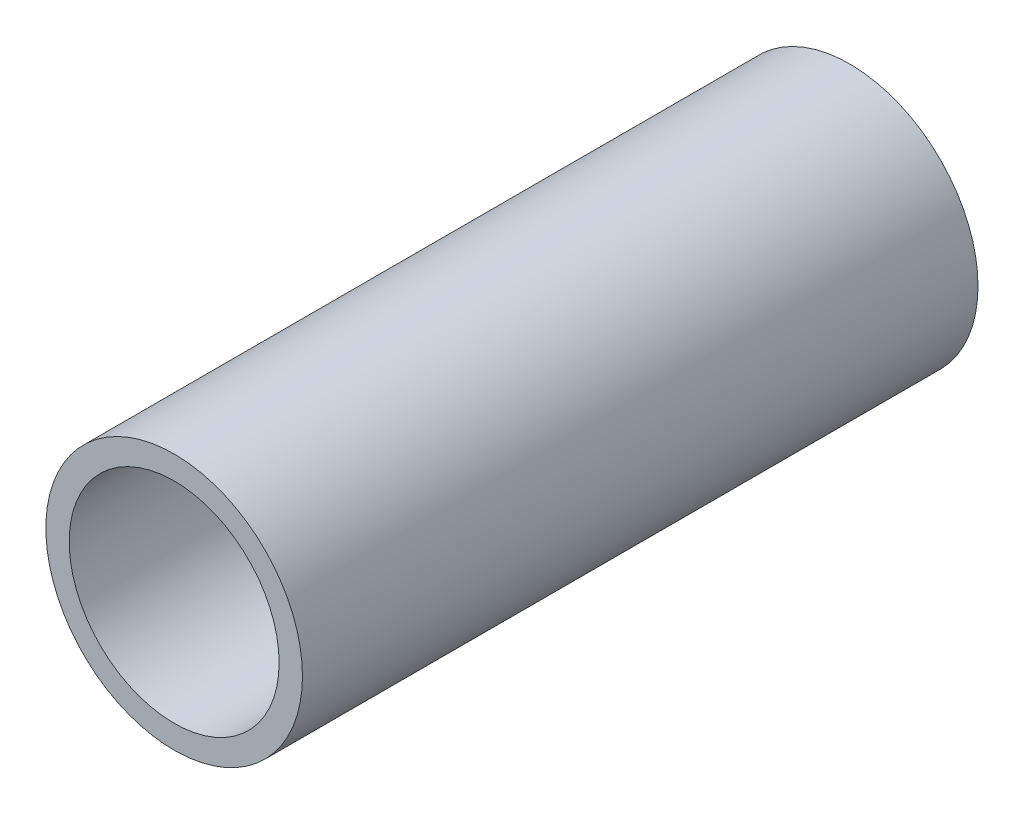
ISO-10303-21;
HEADER;
FILE_DESCRIPTION(('STEP AP214'),'2;1');
FILE_NAME('part.step','',(''),(''),'','','');
FILE_SCHEMA(('AUTOMOTIVE_DESIGN { 1 0 10303 214 1 1 1 1 }'));
ENDSEC;
DATA;
#1=APPLICATION_CONTEXT('core data for automotive mechanical design processes');
#2=APPLICATION_PROTOCOL_DEFINITION('international standard','automotive_design',2000,#1);
#3=PRODUCT_CONTEXT('',#1,'mechanical');
#4=PRODUCT('Part','Part','',(#3));
#5=PRODUCT_RELATED_PRODUCT_CATEGORY('part','',(#4));
#6=PRODUCT_DEFINITION_FORMATION('','',#4);
#7=PRODUCT_DEFINITION_CONTEXT('part definition',#1,'design');
#8=PRODUCT_DEFINITION('design','',#6,#7);
#9=PRODUCT_DEFINITION_SHAPE('','',#8);
#10=(LENGTH_UNIT() NAMED_UNIT(*) SI_UNIT(.MILLI.,.METRE.));
#11=(NAMED_UNIT(*) PLANE_ANGLE_UNIT() SI_UNIT($,.RADIAN.));
#12=(NAMED_UNIT(*) SI_UNIT($,.STERADIAN.) SOLID_ANGLE_UNIT());
#13=UNCERTAINTY_MEASURE_WITH_UNIT(LENGTH_MEASURE(1.E-05),#10,'distance_accuracy_value','');
#14=(GEOMETRIC_REPRESENTATION_CONTEXT(3) GLOBAL_UNCERTAINTY_ASSIGNED_CONTEXT((#13)) GLOBAL_UNIT_ASSIGNED_CONTEXT((#10,
#11,#12)) REPRESENTATION_CONTEXT('',''));
#15=CARTESIAN_POINT('',(0.,0.,0.));
#16=DIRECTION('',(0.,0.,1.));
#17=DIRECTION('',(1.,0.,0.));
#18=AXIS2_PLACEMENT_3D('',#15,#16,#17);
#19=CARTESIAN_POINT('',(0.,0.,-45.974));
#20=DIRECTION('',(0.,0.,1.));
#21=DIRECTION('',(1.,0.,0.));
#22=AXIS2_PLACEMENT_3D('',#19,#20,#21);
#23=CYLINDRICAL_SURFACE('',#22,8.7312499998434);
#24=CARTESIAN_POINT('',(0.,0.,-45.974));
#25=DIRECTION('',(0.,0.,1.));
#26=DIRECTION('',(1.,0.,0.));
#27=AXIS2_PLACEMENT_3D('',#24,#25,#26);
#28=CIRCLE('',#27,8.7312499998434);
#29=CARTESIAN_POINT('',(8.73124999984338,0.,-45.974));
#30=VERTEX_POINT('',#29);
#31=EDGE_CURVE('E10',#30,#30,#28,.T.);
#32=ORIENTED_EDGE('',*,*,#31,.T.);
#33=EDGE_LOOP('',(#32));
#34=FACE_BOUND('',#33,.T.);
#35=CARTESIAN_POINT('',(0.,0.,0.));
#36=DIRECTION('',(0.,0.,1.));
#37=DIRECTION('',(1.,0.,0.));
#38=AXIS2_PLACEMENT_3D('',#35,#36,#37);
#39=CIRCLE('',#38,8.7312499998434);
#40=CARTESIAN_POINT('',(8.73124999984338,0.,0.));
#41=VERTEX_POINT('',#40);
#42=EDGE_CURVE('E33',#41,#41,#39,.T.);
#43=ORIENTED_EDGE('',*,*,#42,.F.);
#44=EDGE_LOOP('',(#43));
#45=FACE_BOUND('',#44,.T.);
#46=ADVANCED_FACE('F30',(#34,#45),#23,.T.);
#47=CARTESIAN_POINT('',(0.,0.,-45.974));
#48=DIRECTION('',(0.,0.,1.));
#49=DIRECTION('',(1.,0.,0.));
#50=AXIS2_PLACEMENT_3D('',#47,#48,#49);
#51=PLANE('',#50);
#52=CARTESIAN_POINT('',(0.,0.,-45.974));
#53=DIRECTION('',(0.,0.,1.));
#54=DIRECTION('',(1.,0.,0.));
#55=AXIS2_PLACEMENT_3D('',#52,#53,#54);
#56=CIRCLE('',#55,7.14375);
#57=CARTESIAN_POINT('',(7.14374999999998,0.,-45.974));
#58=VERTEX_POINT('',#57);
#59=EDGE_CURVE('E40',#58,#58,#56,.T.);
#60=ORIENTED_EDGE('',*,*,#59,.T.);
#61=EDGE_LOOP('',(#60));
#62=FACE_BOUND('',#61,.T.);
#63=ORIENTED_EDGE('',*,*,#31,.F.);
#64=EDGE_LOOP('',(#63));
#65=FACE_BOUND('',#64,.T.);
#66=ADVANCED_FACE('F48',(#62,#65),#51,.F.);
#67=CARTESIAN_POINT('',(0.,0.,0.));
#68=DIRECTION('',(0.,0.,1.));
#69=DIRECTION('',(1.,0.,0.));
#70=AXIS2_PLACEMENT_3D('',#67,#68,#69);
#71=PLANE('',#70);
#72=CARTESIAN_POINT('',(0.,0.,0.));
#73=DIRECTION('',(0.,0.,1.));
#74=DIRECTION('',(1.,0.,0.));
#75=AXIS2_PLACEMENT_3D('',#72,#73,#74);
#76=CIRCLE('',#75,7.14375);
#77=CARTESIAN_POINT('',(7.14374999999998,0.,0.));
#78=VERTEX_POINT('',#77);
#79=EDGE_CURVE('E42',#78,#78,#76,.T.);
#80=ORIENTED_EDGE('',*,*,#79,.F.);
#81=EDGE_LOOP('',(#80));
#82=FACE_BOUND('',#81,.T.);
#83=ORIENTED_EDGE('',*,*,#42,.T.);
#84=EDGE_LOOP('',(#83));
#85=FACE_BOUND('',#84,.T.);
#86=ADVANCED_FACE('F54',(#82,#85),#71,.T.);
#87=CARTESIAN_POINT('',(0.,0.,-45.974));
#88=DIRECTION('',(0.,0.,1.));
#89=DIRECTION('',(1.,0.,0.));
#90=AXIS2_PLACEMENT_3D('',#87,#88,#89);
#91=CYLINDRICAL_SURFACE('',#90,7.14375);
#92=ORIENTED_EDGE('',*,*,#59,.F.);
#93=EDGE_LOOP('',(#92));
#94=FACE_BOUND('',#93,.T.);
#95=ORIENTED_EDGE('',*,*,#79,.T.);
#96=EDGE_LOOP('',(#95));
#97=FACE_BOUND('',#96,.T.);
#98=ADVANCED_FACE('F51',(#94,#97),#91,.F.);
#99=CLOSED_SHELL('',(#46,#66,#86,#98));
#100=MANIFOLD_SOLID_BREP('B2',#99);
#101=ADVANCED_BREP_SHAPE_REPRESENTATION('',(#18,#100),#14);
#102=SHAPE_DEFINITION_REPRESENTATION(#9,#101);
ENDSEC;
END-ISO-10303-21;
